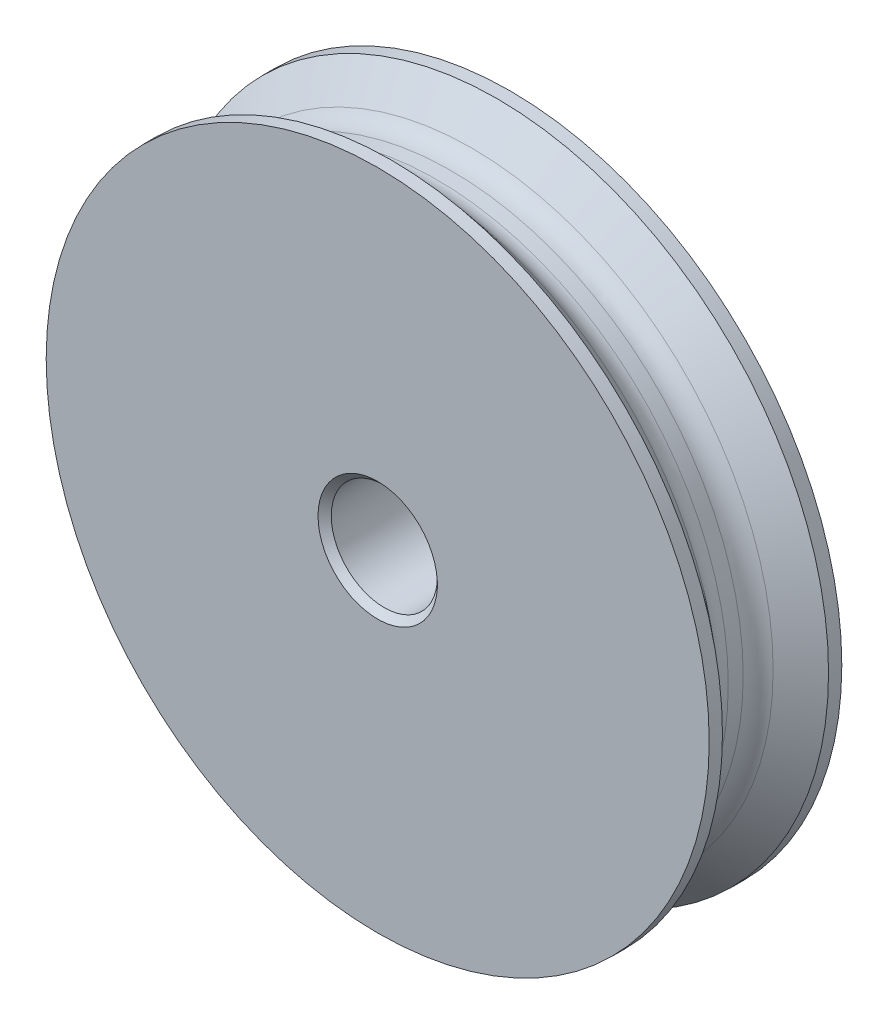
ISO-10303-21;
HEADER;
FILE_DESCRIPTION(('STEP AP214'),'2;1');
FILE_NAME('part.step','',(''),(''),'','','');
FILE_SCHEMA(('AUTOMOTIVE_DESIGN { 1 0 10303 214 1 1 1 1 }'));
ENDSEC;
DATA;
#1=APPLICATION_CONTEXT('core data for automotive mechanical design processes');
#2=APPLICATION_PROTOCOL_DEFINITION('international standard','automotive_design',2000,#1);
#3=PRODUCT_CONTEXT('',#1,'mechanical');
#4=PRODUCT('Part','Part','',(#3));
#5=PRODUCT_RELATED_PRODUCT_CATEGORY('part','',(#4));
#6=PRODUCT_DEFINITION_FORMATION('','',#4);
#7=PRODUCT_DEFINITION_CONTEXT('part definition',#1,'design');
#8=PRODUCT_DEFINITION('design','',#6,#7);
#9=PRODUCT_DEFINITION_SHAPE('','',#8);
#10=(LENGTH_UNIT() NAMED_UNIT(*) SI_UNIT(.MILLI.,.METRE.));
#11=(NAMED_UNIT(*) PLANE_ANGLE_UNIT() SI_UNIT($,.RADIAN.));
#12=(NAMED_UNIT(*) SI_UNIT($,.STERADIAN.) SOLID_ANGLE_UNIT());
#13=UNCERTAINTY_MEASURE_WITH_UNIT(LENGTH_MEASURE(1.E-05),#10,'distance_accuracy_value','');
#14=(GEOMETRIC_REPRESENTATION_CONTEXT(3) GLOBAL_UNCERTAINTY_ASSIGNED_CONTEXT((#13)) GLOBAL_UNIT_ASSIGNED_CONTEXT((#10,
#11,#12)) REPRESENTATION_CONTEXT('',''));
#15=CARTESIAN_POINT('',(0.,0.,0.));
#16=DIRECTION('',(0.,0.,1.));
#17=DIRECTION('',(1.,0.,0.));
#18=AXIS2_PLACEMENT_3D('',#15,#16,#17);
#19=CARTESIAN_POINT('',(0.,4.,5.));
#20=DIRECTION('',(0.,0.,-1.));
#21=DIRECTION('',(-1.,0.,0.));
#22=AXIS2_PLACEMENT_3D('',#19,#20,#21);
#23=PLANE('',#22);
#24=CARTESIAN_POINT('',(0.,0.,5.));
#25=DIRECTION('',(0.,0.,-1.));
#26=DIRECTION('',(-1.,0.,0.));
#27=AXIS2_PLACEMENT_3D('',#24,#25,#26);
#28=CIRCLE('',#27,4.50000000000001);
#29=CARTESIAN_POINT('',(-4.50000000000001,0.,5.));
#30=VERTEX_POINT('',#29);
#31=EDGE_CURVE('E10',#30,#30,#28,.T.);
#32=ORIENTED_EDGE('',*,*,#31,.T.);
#33=EDGE_LOOP('',(#32));
#34=FACE_BOUND('',#33,.T.);
#35=CARTESIAN_POINT('',(0.,0.,5.));
#36=DIRECTION('',(0.,0.,1.));
#37=DIRECTION('',(1.,0.,0.));
#38=AXIS2_PLACEMENT_3D('',#35,#36,#37);
#39=CIRCLE('',#38,25.);
#40=CARTESIAN_POINT('',(25.,0.,5.));
#41=VERTEX_POINT('',#40);
#42=EDGE_CURVE('E72',#41,#41,#39,.T.);
#43=ORIENTED_EDGE('',*,*,#42,.T.);
#44=EDGE_LOOP('',(#43));
#45=FACE_BOUND('',#44,.T.);
#46=ADVANCED_FACE('F41',(#34,#45),#23,.F.);
#47=CARTESIAN_POINT('',(0.,0.,0.));
#48=DIRECTION('',(0.,0.,1.));
#49=DIRECTION('',(1.,0.,0.));
#50=AXIS2_PLACEMENT_3D('',#47,#48,#49);
#51=CYLINDRICAL_SURFACE('',#50,25.);
#52=ORIENTED_EDGE('',*,*,#42,.F.);
#53=EDGE_LOOP('',(#52));
#54=FACE_BOUND('',#53,.T.);
#55=CARTESIAN_POINT('',(0.,0.,4.));
#56=DIRECTION('',(0.,0.,1.));
#57=DIRECTION('',(1.,0.,0.));
#58=AXIS2_PLACEMENT_3D('',#55,#56,#57);
#59=CIRCLE('',#58,25.);
#60=CARTESIAN_POINT('',(25.,0.,4.));
#61=VERTEX_POINT('',#60);
#62=EDGE_CURVE('E80',#61,#61,#59,.T.);
#63=ORIENTED_EDGE('',*,*,#62,.T.);
#64=EDGE_LOOP('',(#63));
#65=FACE_BOUND('',#64,.T.);
#66=ADVANCED_FACE('F101',(#54,#65),#51,.T.);
#67=CARTESIAN_POINT('',(0.,0.,1.5));
#68=DIRECTION('',(0.,0.,1.));
#69=DIRECTION('',(1.,0.,0.));
#70=AXIS2_PLACEMENT_3D('',#67,#68,#69);
#71=CONICAL_SURFACE('',#70,22.,0.876058050598193);
#72=CARTESIAN_POINT('',(0.,0.,2.09969266722587));
#73=DIRECTION('',(0.,0.,1.));
#74=DIRECTION('',(1.,0.,0.));
#75=AXIS2_PLACEMENT_3D('',#72,#73,#74);
#76=CIRCLE('',#75,22.719631200671);
#77=CARTESIAN_POINT('',(22.719631200671,0.,2.09969266722587));
#78=VERTEX_POINT('',#77);
#79=EDGE_CURVE('E62',#78,#78,#76,.T.);
#80=ORIENTED_EDGE('',*,*,#79,.T.);
#81=EDGE_LOOP('',(#80));
#82=FACE_BOUND('',#81,.T.);
#83=ORIENTED_EDGE('',*,*,#62,.F.);
#84=EDGE_LOOP('',(#83));
#85=FACE_BOUND('',#84,.T.);
#86=ADVANCED_FACE('F109',(#82,#85),#71,.T.);
#87=CARTESIAN_POINT('',(0.,0.,0.));
#88=DIRECTION('',(0.,0.,1.));
#89=DIRECTION('',(1.,0.,0.));
#90=AXIS2_PLACEMENT_3D('',#87,#88,#89);
#91=CYLINDRICAL_SURFACE('',#90,22.);
#92=CARTESIAN_POINT('',(0.,0.,-0.563250108031113));
#93=DIRECTION('',(0.,0.,1.));
#94=DIRECTION('',(1.,0.,0.));
#95=AXIS2_PLACEMENT_3D('',#92,#93,#94);
#96=CIRCLE('',#95,22.);
#97=CARTESIAN_POINT('',(22.,0.,-0.563250108031113));
#98=VERTEX_POINT('',#97);
#99=EDGE_CURVE('E68',#98,#98,#96,.T.);
#100=ORIENTED_EDGE('',*,*,#99,.T.);
#101=EDGE_LOOP('',(#100));
#102=FACE_BOUND('',#101,.T.);
#103=CARTESIAN_POINT('',(0.,0.,0.563250108031113));
#104=DIRECTION('',(0.,0.,1.));
#105=DIRECTION('',(1.,0.,0.));
#106=AXIS2_PLACEMENT_3D('',#103,#104,#105);
#107=CIRCLE('',#106,22.);
#108=CARTESIAN_POINT('',(22.,0.,0.563250108031113));
#109=VERTEX_POINT('',#108);
#110=EDGE_CURVE('E71',#109,#109,#107,.F.);
#111=ORIENTED_EDGE('',*,*,#110,.T.);
#112=EDGE_LOOP('',(#111));
#113=FACE_BOUND('',#112,.T.);
#114=ADVANCED_FACE('F183',(#102,#113),#91,.T.);
#115=CARTESIAN_POINT('',(0.,0.,-4.));
#116=DIRECTION('',(0.,0.,-1.));
#117=DIRECTION('',(-1.,0.,0.));
#118=AXIS2_PLACEMENT_3D('',#115,#116,#117);
#119=CONICAL_SURFACE('',#118,25.,0.876058050598193);
#120=CARTESIAN_POINT('',(0.,0.,-2.09969266722587));
#121=DIRECTION('',(0.,0.,-1.));
#122=DIRECTION('',(-1.,0.,0.));
#123=AXIS2_PLACEMENT_3D('',#120,#121,#122);
#124=CIRCLE('',#123,22.719631200671);
#125=CARTESIAN_POINT('',(-22.719631200671,0.,-2.09969266722587));
#126=VERTEX_POINT('',#125);
#127=EDGE_CURVE('E65',#126,#126,#124,.T.);
#128=ORIENTED_EDGE('',*,*,#127,.T.);
#129=EDGE_LOOP('',(#128));
#130=FACE_BOUND('',#129,.T.);
#131=CARTESIAN_POINT('',(0.,0.,-4.));
#132=DIRECTION('',(0.,0.,1.));
#133=DIRECTION('',(1.,0.,0.));
#134=AXIS2_PLACEMENT_3D('',#131,#132,#133);
#135=CIRCLE('',#134,25.);
#136=CARTESIAN_POINT('',(25.,0.,-4.));
#137=VERTEX_POINT('',#136);
#138=EDGE_CURVE('E78',#137,#137,#135,.T.);
#139=ORIENTED_EDGE('',*,*,#138,.T.);
#140=EDGE_LOOP('',(#139));
#141=FACE_BOUND('',#140,.T.);
#142=ADVANCED_FACE('F102',(#130,#141),#119,.T.);
#143=CARTESIAN_POINT('',(0.,0.,0.));
#144=DIRECTION('',(0.,0.,1.));
#145=DIRECTION('',(1.,0.,0.));
#146=AXIS2_PLACEMENT_3D('',#143,#144,#145);
#147=CYLINDRICAL_SURFACE('',#146,25.);
#148=ORIENTED_EDGE('',*,*,#138,.F.);
#149=EDGE_LOOP('',(#148));
#150=FACE_BOUND('',#149,.T.);
#151=CARTESIAN_POINT('',(0.,0.,-5.));
#152=DIRECTION('',(0.,0.,1.));
#153=DIRECTION('',(1.,0.,0.));
#154=AXIS2_PLACEMENT_3D('',#151,#152,#153);
#155=CIRCLE('',#154,25.);
#156=CARTESIAN_POINT('',(25.,0.,-5.));
#157=VERTEX_POINT('',#156);
#158=EDGE_CURVE('E81',#157,#157,#155,.T.);
#159=ORIENTED_EDGE('',*,*,#158,.T.);
#160=EDGE_LOOP('',(#159));
#161=FACE_BOUND('',#160,.T.);
#162=ADVANCED_FACE('F87',(#150,#161),#147,.T.);
#163=CARTESIAN_POINT('',(0.,4.,-5.));
#164=DIRECTION('',(0.,0.,1.));
#165=DIRECTION('',(1.,0.,0.));
#166=AXIS2_PLACEMENT_3D('',#163,#164,#165);
#167=PLANE('',#166);
#168=CARTESIAN_POINT('',(0.,0.,-5.));
#169=DIRECTION('',(0.,0.,1.));
#170=DIRECTION('',(1.,0.,0.));
#171=AXIS2_PLACEMENT_3D('',#168,#169,#170);
#172=CIRCLE('',#171,4.49999999999998);
#173=CARTESIAN_POINT('',(4.49999999999998,0.,-5.));
#174=VERTEX_POINT('',#173);
#175=EDGE_CURVE('E60',#174,#174,#172,.T.);
#176=ORIENTED_EDGE('',*,*,#175,.T.);
#177=EDGE_LOOP('',(#176));
#178=FACE_BOUND('',#177,.T.);
#179=ORIENTED_EDGE('',*,*,#158,.F.);
#180=EDGE_LOOP('',(#179));
#181=FACE_BOUND('',#180,.T.);
#182=ADVANCED_FACE('F88',(#178,#181),#167,.F.);
#183=CARTESIAN_POINT('',(0.,0.,0.));
#184=DIRECTION('',(0.,0.,1.));
#185=DIRECTION('',(1.,0.,0.));
#186=AXIS2_PLACEMENT_3D('',#183,#184,#185);
#187=CYLINDRICAL_SURFACE('',#186,4.);
#188=CARTESIAN_POINT('',(0.,0.,-4.50000000000001));
#189=DIRECTION('',(0.,0.,1.));
#190=DIRECTION('',(1.,0.,0.));
#191=AXIS2_PLACEMENT_3D('',#188,#189,#190);
#192=CIRCLE('',#191,4.);
#193=CARTESIAN_POINT('',(4.,0.,-4.50000000000001));
#194=VERTEX_POINT('',#193);
#195=EDGE_CURVE('E47',#194,#194,#192,.F.);
#196=ORIENTED_EDGE('',*,*,#195,.T.);
#197=EDGE_LOOP('',(#196));
#198=FACE_BOUND('',#197,.T.);
#199=CARTESIAN_POINT('',(0.,0.,4.49999999999999));
#200=DIRECTION('',(0.,0.,-1.));
#201=DIRECTION('',(-1.,0.,0.));
#202=AXIS2_PLACEMENT_3D('',#199,#200,#201);
#203=CIRCLE('',#202,4.);
#204=CARTESIAN_POINT('',(-4.,0.,4.49999999999999));
#205=VERTEX_POINT('',#204);
#206=EDGE_CURVE('E52',#205,#205,#203,.F.);
#207=ORIENTED_EDGE('',*,*,#206,.T.);
#208=EDGE_LOOP('',(#207));
#209=FACE_BOUND('',#208,.T.);
#210=ADVANCED_FACE('F91',(#198,#209),#187,.F.);
#211=CARTESIAN_POINT('',(0.,0.,-0.563250108031113));
#212=DIRECTION('',(0.,0.,1.));
#213=DIRECTION('',(1.,0.,0.));
#214=AXIS2_PLACEMENT_3D('',#211,#212,#213);
#215=TOROIDAL_SURFACE('',#214,24.,2.);
#216=ORIENTED_EDGE('',*,*,#127,.F.);
#217=EDGE_LOOP('',(#216));
#218=FACE_BOUND('',#217,.T.);
#219=ORIENTED_EDGE('',*,*,#99,.F.);
#220=EDGE_LOOP('',(#219));
#221=FACE_BOUND('',#220,.T.);
#222=ADVANCED_FACE('F98',(#218,#221),#215,.F.);
#223=CARTESIAN_POINT('',(0.,0.,0.563250108031113));
#224=DIRECTION('',(0.,0.,1.));
#225=DIRECTION('',(1.,0.,0.));
#226=AXIS2_PLACEMENT_3D('',#223,#224,#225);
#227=TOROIDAL_SURFACE('',#226,24.,2.);
#228=ORIENTED_EDGE('',*,*,#110,.F.);
#229=EDGE_LOOP('',(#228));
#230=FACE_BOUND('',#229,.T.);
#231=ORIENTED_EDGE('',*,*,#79,.F.);
#232=EDGE_LOOP('',(#231));
#233=FACE_BOUND('',#232,.T.);
#234=ADVANCED_FACE('F118',(#230,#233),#227,.F.);
#235=CARTESIAN_POINT('',(0.,0.,-5.));
#236=DIRECTION('',(0.,0.,-1.));
#237=DIRECTION('',(-1.,0.,0.));
#238=AXIS2_PLACEMENT_3D('',#235,#236,#237);
#239=CONICAL_SURFACE('',#238,4.49999999999998,0.785398163397441);
#240=ORIENTED_EDGE('',*,*,#195,.F.);
#241=EDGE_LOOP('',(#240));
#242=FACE_BOUND('',#241,.T.);
#243=ORIENTED_EDGE('',*,*,#175,.F.);
#244=EDGE_LOOP('',(#243));
#245=FACE_BOUND('',#244,.T.);
#246=ADVANCED_FACE('F119',(#242,#245),#239,.F.);
#247=CARTESIAN_POINT('',(0.,0.,4.49999999999999));
#248=DIRECTION('',(0.,0.,1.));
#249=DIRECTION('',(1.,0.,0.));
#250=AXIS2_PLACEMENT_3D('',#247,#248,#249);
#251=CONICAL_SURFACE('',#250,4.,0.785398163397448);
#252=ORIENTED_EDGE('',*,*,#31,.F.);
#253=EDGE_LOOP('',(#252));
#254=FACE_BOUND('',#253,.T.);
#255=ORIENTED_EDGE('',*,*,#206,.F.);
#256=EDGE_LOOP('',(#255));
#257=FACE_BOUND('',#256,.T.);
#258=ADVANCED_FACE('F42',(#254,#257),#251,.F.);
#259=CLOSED_SHELL('',(#46,#66,#86,#114,#142,#162,#182,#210,#222,#234,#246,#258));
#260=MANIFOLD_SOLID_BREP('B2',#259);
#261=ADVANCED_BREP_SHAPE_REPRESENTATION('',(#18,#260),#14);
#262=SHAPE_DEFINITION_REPRESENTATION(#9,#261);
ENDSEC;
END-ISO-10303-21;
